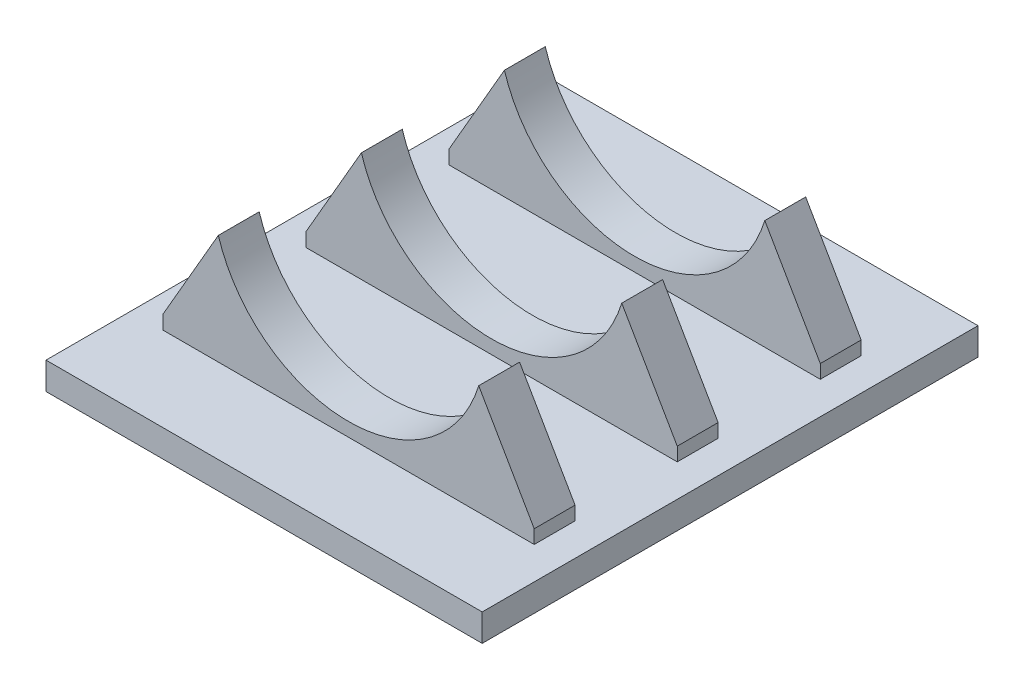
ISO-10303-21;
HEADER;
FILE_DESCRIPTION(('STEP AP214'),'2;1');
FILE_NAME('part.step','',(''),(''),'','','');
FILE_SCHEMA(('AUTOMOTIVE_DESIGN { 1 0 10303 214 1 1 1 1 }'));
ENDSEC;
DATA;
#1=APPLICATION_CONTEXT('core data for automotive mechanical design processes');
#2=APPLICATION_PROTOCOL_DEFINITION('international standard','automotive_design',2000,#1);
#3=PRODUCT_CONTEXT('',#1,'mechanical');
#4=PRODUCT('Part','Part','',(#3));
#5=PRODUCT_RELATED_PRODUCT_CATEGORY('part','',(#4));
#6=PRODUCT_DEFINITION_FORMATION('','',#4);
#7=PRODUCT_DEFINITION_CONTEXT('part definition',#1,'design');
#8=PRODUCT_DEFINITION('design','',#6,#7);
#9=PRODUCT_DEFINITION_SHAPE('','',#8);
#10=(LENGTH_UNIT() NAMED_UNIT(*) SI_UNIT(.MILLI.,.METRE.));
#11=(NAMED_UNIT(*) PLANE_ANGLE_UNIT() SI_UNIT($,.RADIAN.));
#12=(NAMED_UNIT(*) SI_UNIT($,.STERADIAN.) SOLID_ANGLE_UNIT());
#13=UNCERTAINTY_MEASURE_WITH_UNIT(LENGTH_MEASURE(1.E-05),#10,'distance_accuracy_value','');
#14=(GEOMETRIC_REPRESENTATION_CONTEXT(3) GLOBAL_UNCERTAINTY_ASSIGNED_CONTEXT((#13)) GLOBAL_UNIT_ASSIGNED_CONTEXT((#10,
#11,#12)) REPRESENTATION_CONTEXT('',''));
#15=CARTESIAN_POINT('',(0.,0.,0.));
#16=DIRECTION('',(0.,0.,1.));
#17=DIRECTION('',(1.,0.,0.));
#18=AXIS2_PLACEMENT_3D('',#15,#16,#17);
#19=CARTESIAN_POINT('',(0.,-4.99999999999908,0.));
#20=DIRECTION('',(0.,1.,0.));
#21=DIRECTION('',(0.,0.,1.));
#22=AXIS2_PLACEMENT_3D('',#19,#20,#21);
#23=PLANE('',#22);
#24=DIRECTION('',(0.,0.,-1.));
#25=VECTOR('',#24,1.);
#26=CARTESIAN_POINT('',(-68.1528501835808,-4.99999999999908,15.));
#27=LINE('',#26,#25);
#28=CARTESIAN_POINT('',(-68.1528501835808,-4.99999999999908,15.));
#29=VERTEX_POINT('',#28);
#30=CARTESIAN_POINT('',(-68.1528501835808,-4.99999999999908,0.));
#31=VERTEX_POINT('',#30);
#32=EDGE_CURVE('E340',#29,#31,#27,.T.);
#33=ORIENTED_EDGE('',*,*,#32,.T.);
#34=DIRECTION('',(1.,0.,0.));
#35=VECTOR('',#34,1.);
#36=CARTESIAN_POINT('',(-68.1528501835808,-4.99999999999908,0.));
#37=LINE('',#36,#35);
#38=CARTESIAN_POINT('',(68.152850183576,-4.99999999999908,0.));
#39=VERTEX_POINT('',#38);
#40=EDGE_CURVE('E326',#31,#39,#37,.T.);
#41=ORIENTED_EDGE('',*,*,#40,.T.);
#42=DIRECTION('',(0.,0.,-1.));
#43=VECTOR('',#42,1.);
#44=CARTESIAN_POINT('',(68.152850183576,-4.99999999999908,15.));
#45=LINE('',#44,#43);
#46=CARTESIAN_POINT('',(68.152850183576,-4.99999999999908,15.));
#47=VERTEX_POINT('',#46);
#48=EDGE_CURVE('E342',#47,#39,#45,.T.);
#49=ORIENTED_EDGE('',*,*,#48,.F.);
#50=DIRECTION('',(1.,0.,0.));
#51=VECTOR('',#50,1.);
#52=CARTESIAN_POINT('',(-68.1528501835808,-4.99999999999908,15.));
#53=LINE('',#52,#51);
#54=EDGE_CURVE('E313',#29,#47,#53,.T.);
#55=ORIENTED_EDGE('',*,*,#54,.F.);
#56=EDGE_LOOP('',(#33,#41,#49,#55));
#57=FACE_BOUND('',#56,.T.);
#58=DIRECTION('',(0.,0.,-1.));
#59=VECTOR('',#58,1.);
#60=CARTESIAN_POINT('',(80.0458637595088,-4.99999999999908,150.989001655881));
#61=LINE('',#60,#59);
#62=CARTESIAN_POINT('',(80.0458637595088,-4.99999999999908,150.989001655881));
#63=VERTEX_POINT('',#62);
#64=CARTESIAN_POINT('',(80.0458637595088,-4.99999999999908,-30.9890016558809));
#65=VERTEX_POINT('',#64);
#66=EDGE_CURVE('E264',#63,#65,#61,.T.);
#67=ORIENTED_EDGE('',*,*,#66,.T.);
#68=DIRECTION('',(-1.,0.,0.));
#69=VECTOR('',#68,1.);
#70=CARTESIAN_POINT('',(80.0458637595088,-4.99999999999908,-30.9890016558809));
#71=LINE('',#70,#69);
#72=CARTESIAN_POINT('',(-80.0458637595088,-4.99999999999908,-30.9890016558809));
#73=VERTEX_POINT('',#72);
#74=EDGE_CURVE('E291',#65,#73,#71,.T.);
#75=ORIENTED_EDGE('',*,*,#74,.T.);
#76=DIRECTION('',(0.,0.,-1.));
#77=VECTOR('',#76,1.);
#78=CARTESIAN_POINT('',(-80.0458637595088,-4.99999999999908,150.989001655881));
#79=LINE('',#78,#77);
#80=CARTESIAN_POINT('',(-80.0458637595088,-4.99999999999908,150.989001655881));
#81=VERTEX_POINT('',#80);
#82=EDGE_CURVE('E294',#81,#73,#79,.T.);
#83=ORIENTED_EDGE('',*,*,#82,.F.);
#84=DIRECTION('',(-1.,0.,0.));
#85=VECTOR('',#84,1.);
#86=CARTESIAN_POINT('',(80.0458637595088,-4.99999999999908,150.989001655881));
#87=LINE('',#86,#85);
#88=EDGE_CURVE('E281',#63,#81,#87,.T.);
#89=ORIENTED_EDGE('',*,*,#88,.F.);
#90=EDGE_LOOP('',(#67,#75,#83,#89));
#91=FACE_BOUND('',#90,.T.);
#92=DIRECTION('',(0.,0.,-1.));
#93=VECTOR('',#92,1.);
#94=CARTESIAN_POINT('',(68.152850183576,-4.99999999999908,67.5));
#95=LINE('',#94,#93);
#96=CARTESIAN_POINT('',(68.152850183576,-4.99999999999908,67.5));
#97=VERTEX_POINT('',#96);
#98=CARTESIAN_POINT('',(68.152850183576,-4.99999999999908,52.5));
#99=VERTEX_POINT('',#98);
#100=EDGE_CURVE('E273',#97,#99,#95,.T.);
#101=ORIENTED_EDGE('',*,*,#100,.F.);
#102=DIRECTION('',(1.,0.,0.));
#103=VECTOR('',#102,1.);
#104=CARTESIAN_POINT('',(-68.1528501835808,-4.99999999999908,67.5));
#105=LINE('',#104,#103);
#106=CARTESIAN_POINT('',(-68.1528501835808,-4.99999999999908,67.5));
#107=VERTEX_POINT('',#106);
#108=EDGE_CURVE('E238',#107,#97,#105,.T.);
#109=ORIENTED_EDGE('',*,*,#108,.F.);
#110=DIRECTION('',(0.,0.,-1.));
#111=VECTOR('',#110,1.);
#112=CARTESIAN_POINT('',(-68.1528501835808,-4.99999999999908,67.5));
#113=LINE('',#112,#111);
#114=CARTESIAN_POINT('',(-68.1528501835808,-4.99999999999908,52.5));
#115=VERTEX_POINT('',#114);
#116=EDGE_CURVE('E271',#107,#115,#113,.T.);
#117=ORIENTED_EDGE('',*,*,#116,.T.);
#118=DIRECTION('',(1.,0.,0.));
#119=VECTOR('',#118,1.);
#120=CARTESIAN_POINT('',(-68.1528501835808,-4.99999999999908,52.5));
#121=LINE('',#120,#119);
#122=EDGE_CURVE('E254',#115,#99,#121,.T.);
#123=ORIENTED_EDGE('',*,*,#122,.T.);
#124=EDGE_LOOP('',(#101,#109,#117,#123));
#125=FACE_BOUND('',#124,.T.);
#126=DIRECTION('',(0.,0.,-1.));
#127=VECTOR('',#126,1.);
#128=CARTESIAN_POINT('',(68.152850183576,-4.99999999999908,120.));
#129=LINE('',#128,#127);
#130=CARTESIAN_POINT('',(68.152850183576,-4.99999999999908,120.));
#131=VERTEX_POINT('',#130);
#132=CARTESIAN_POINT('',(68.152850183576,-4.99999999999908,105.));
#133=VERTEX_POINT('',#132);
#134=EDGE_CURVE('E55',#131,#133,#129,.T.);
#135=ORIENTED_EDGE('',*,*,#134,.F.);
#136=DIRECTION('',(1.,0.,0.));
#137=VECTOR('',#136,1.);
#138=CARTESIAN_POINT('',(-68.1528501835808,-4.99999999999908,120.));
#139=LINE('',#138,#137);
#140=CARTESIAN_POINT('',(-68.1528501835808,-4.99999999999908,120.));
#141=VERTEX_POINT('',#140);
#142=EDGE_CURVE('E50',#141,#131,#139,.T.);
#143=ORIENTED_EDGE('',*,*,#142,.F.);
#144=DIRECTION('',(0.,0.,-1.));
#145=VECTOR('',#144,1.);
#146=CARTESIAN_POINT('',(-68.1528501835808,-4.99999999999908,120.));
#147=LINE('',#146,#145);
#148=CARTESIAN_POINT('',(-68.1528501835808,-4.99999999999908,105.));
#149=VERTEX_POINT('',#148);
#150=EDGE_CURVE('E229',#141,#149,#147,.T.);
#151=ORIENTED_EDGE('',*,*,#150,.T.);
#152=DIRECTION('',(1.,0.,0.));
#153=VECTOR('',#152,1.);
#154=CARTESIAN_POINT('',(-68.1528501835808,-4.99999999999908,105.));
#155=LINE('',#154,#153);
#156=EDGE_CURVE('E215',#149,#133,#155,.T.);
#157=ORIENTED_EDGE('',*,*,#156,.T.);
#158=EDGE_LOOP('',(#135,#143,#151,#157));
#159=FACE_BOUND('',#158,.T.);
#160=ADVANCED_FACE('F33',(#57,#91,#125,#159),#23,.T.);
#161=CARTESIAN_POINT('',(47.7840512524467,35.2797946378719,15.));
#162=DIRECTION('',(0.86602540378444,0.499999999999998,0.));
#163=DIRECTION('',(-0.499999999999998,0.86602540378444,0.));
#164=AXIS2_PLACEMENT_3D('',#161,#162,#163);
#165=PLANE('',#164);
#166=DIRECTION('',(0.499999999999998,-0.86602540378444,0.));
#167=VECTOR('',#166,1.);
#168=CARTESIAN_POINT('',(47.7840512524467,35.2797946378719,0.));
#169=LINE('',#168,#167);
#170=CARTESIAN_POINT('',(47.7840512524472,35.2797946378717,0.));
#171=VERTEX_POINT('',#170);
#172=CARTESIAN_POINT('',(68.152850183576,9.24607612695653E-13,0.));
#173=VERTEX_POINT('',#172);
#174=EDGE_CURVE('E300',#171,#173,#169,.T.);
#175=ORIENTED_EDGE('',*,*,#174,.F.);
#176=DIRECTION('',(0.,0.,-1.));
#177=VECTOR('',#176,1.);
#178=CARTESIAN_POINT('',(47.7840512524472,35.2797946378717,15.));
#179=LINE('',#178,#177);
#180=CARTESIAN_POINT('',(47.7840512524472,35.2797946378717,15.));
#181=VERTEX_POINT('',#180);
#182=EDGE_CURVE('E11',#181,#171,#179,.T.);
#183=ORIENTED_EDGE('',*,*,#182,.F.);
#184=DIRECTION('',(0.499999999999998,-0.86602540378444,0.));
#185=VECTOR('',#184,1.);
#186=CARTESIAN_POINT('',(47.7840512524467,35.2797946378719,15.));
#187=LINE('',#186,#185);
#188=CARTESIAN_POINT('',(68.152850183576,9.24607612695653E-13,15.));
#189=VERTEX_POINT('',#188);
#190=EDGE_CURVE('E307',#181,#189,#187,.T.);
#191=ORIENTED_EDGE('',*,*,#190,.T.);
#192=DIRECTION('',(0.,0.,-1.));
#193=VECTOR('',#192,1.);
#194=CARTESIAN_POINT('',(68.152850183576,9.24607612695653E-13,15.));
#195=LINE('',#194,#193);
#196=EDGE_CURVE('E37',#189,#173,#195,.T.);
#197=ORIENTED_EDGE('',*,*,#196,.T.);
#198=EDGE_LOOP('',(#175,#183,#191,#197));
#199=FACE_BOUND('',#198,.T.);
#200=ADVANCED_FACE('F35',(#199),#165,.T.);
#201=CARTESIAN_POINT('',(-1.83980326487098E-12,50.0000000000026,15.));
#202=DIRECTION('',(0.,0.,-1.));
#203=DIRECTION('',(-1.,0.,0.));
#204=AXIS2_PLACEMENT_3D('',#201,#202,#203);
#205=CYLINDRICAL_SURFACE('',#204,49.9999999999998);
#206=CARTESIAN_POINT('',(-1.83980326487098E-12,50.0000000000026,0.));
#207=DIRECTION('',(0.,0.,-1.));
#208=DIRECTION('',(-1.,0.,0.));
#209=AXIS2_PLACEMENT_3D('',#206,#207,#208);
#210=CIRCLE('',#209,49.9999999999998);
#211=CARTESIAN_POINT('',(-47.7840512524509,35.279794637872,0.));
#212=VERTEX_POINT('',#211);
#213=EDGE_CURVE('E311',#171,#212,#210,.T.);
#214=ORIENTED_EDGE('',*,*,#213,.T.);
#215=DIRECTION('',(0.,0.,-1.));
#216=VECTOR('',#215,1.);
#217=CARTESIAN_POINT('',(-47.7840512524509,35.279794637872,15.));
#218=LINE('',#217,#216);
#219=CARTESIAN_POINT('',(-47.7840512524509,35.279794637872,15.));
#220=VERTEX_POINT('',#219);
#221=EDGE_CURVE('E42',#220,#212,#218,.T.);
#222=ORIENTED_EDGE('',*,*,#221,.F.);
#223=CARTESIAN_POINT('',(-1.83980326487098E-12,50.0000000000026,15.));
#224=DIRECTION('',(0.,0.,-1.));
#225=DIRECTION('',(-1.,0.,0.));
#226=AXIS2_PLACEMENT_3D('',#223,#224,#225);
#227=CIRCLE('',#226,49.9999999999998);
#228=EDGE_CURVE('E319',#181,#220,#227,.T.);
#229=ORIENTED_EDGE('',*,*,#228,.F.);
#230=ORIENTED_EDGE('',*,*,#182,.T.);
#231=EDGE_LOOP('',(#214,#222,#229,#230));
#232=FACE_BOUND('',#231,.T.);
#233=ADVANCED_FACE('F359',(#232),#205,.F.);
#234=CARTESIAN_POINT('',(-47.7840512524514,35.2797946378719,15.));
#235=DIRECTION('',(0.86602540378444,-0.499999999999998,0.));
#236=DIRECTION('',(0.499999999999998,0.86602540378444,0.));
#237=AXIS2_PLACEMENT_3D('',#234,#235,#236);
#238=PLANE('',#237);
#239=DIRECTION('',(-0.499999999999998,-0.86602540378444,0.));
#240=VECTOR('',#239,1.);
#241=CARTESIAN_POINT('',(-47.7840512524514,35.2797946378719,0.));
#242=LINE('',#241,#240);
#243=CARTESIAN_POINT('',(-68.1528501835808,9.24607612695653E-13,0.));
#244=VERTEX_POINT('',#243);
#245=EDGE_CURVE('E332',#212,#244,#242,.T.);
#246=ORIENTED_EDGE('',*,*,#245,.T.);
#247=DIRECTION('',(0.,0.,-1.));
#248=VECTOR('',#247,1.);
#249=CARTESIAN_POINT('',(-68.1528501835808,9.24607612695653E-13,15.));
#250=LINE('',#249,#248);
#251=CARTESIAN_POINT('',(-68.1528501835808,9.24607612695653E-13,15.));
#252=VERTEX_POINT('',#251);
#253=EDGE_CURVE('E337',#252,#244,#250,.T.);
#254=ORIENTED_EDGE('',*,*,#253,.F.);
#255=DIRECTION('',(-0.499999999999998,-0.86602540378444,0.));
#256=VECTOR('',#255,1.);
#257=CARTESIAN_POINT('',(-47.7840512524514,35.2797946378719,15.));
#258=LINE('',#257,#256);
#259=EDGE_CURVE('E317',#220,#252,#258,.T.);
#260=ORIENTED_EDGE('',*,*,#259,.F.);
#261=ORIENTED_EDGE('',*,*,#221,.T.);
#262=EDGE_LOOP('',(#246,#254,#260,#261));
#263=FACE_BOUND('',#262,.T.);
#264=ADVANCED_FACE('F363',(#263),#238,.F.);
#265=CARTESIAN_POINT('',(-68.1528501835808,9.24607612695653E-13,15.));
#266=DIRECTION('',(1.,0.,0.));
#267=DIRECTION('',(0.,1.,0.));
#268=AXIS2_PLACEMENT_3D('',#265,#266,#267);
#269=PLANE('',#268);
#270=DIRECTION('',(0.,-1.,0.));
#271=VECTOR('',#270,1.);
#272=CARTESIAN_POINT('',(-68.1528501835808,9.24607612695653E-13,0.));
#273=LINE('',#272,#271);
#274=EDGE_CURVE('E329',#244,#31,#273,.T.);
#275=ORIENTED_EDGE('',*,*,#274,.T.);
#276=ORIENTED_EDGE('',*,*,#32,.F.);
#277=DIRECTION('',(0.,-1.,0.));
#278=VECTOR('',#277,1.);
#279=CARTESIAN_POINT('',(-68.1528501835808,9.24607612695653E-13,15.));
#280=LINE('',#279,#278);
#281=EDGE_CURVE('E315',#252,#29,#280,.T.);
#282=ORIENTED_EDGE('',*,*,#281,.F.);
#283=ORIENTED_EDGE('',*,*,#253,.T.);
#284=EDGE_LOOP('',(#275,#276,#282,#283));
#285=FACE_BOUND('',#284,.T.);
#286=ADVANCED_FACE('F373',(#285),#269,.F.);
#287=CARTESIAN_POINT('',(68.152850183576,-4.99999999999908,15.));
#288=DIRECTION('',(-1.,0.,0.));
#289=DIRECTION('',(0.,-1.,0.));
#290=AXIS2_PLACEMENT_3D('',#287,#288,#289);
#291=PLANE('',#290);
#292=DIRECTION('',(0.,1.,0.));
#293=VECTOR('',#292,1.);
#294=CARTESIAN_POINT('',(68.152850183576,-4.99999999999908,0.));
#295=LINE('',#294,#293);
#296=EDGE_CURVE('E323',#39,#173,#295,.T.);
#297=ORIENTED_EDGE('',*,*,#296,.T.);
#298=ORIENTED_EDGE('',*,*,#196,.F.);
#299=DIRECTION('',(0.,1.,0.));
#300=VECTOR('',#299,1.);
#301=CARTESIAN_POINT('',(68.152850183576,-4.99999999999908,15.));
#302=LINE('',#301,#300);
#303=EDGE_CURVE('E310',#47,#189,#302,.T.);
#304=ORIENTED_EDGE('',*,*,#303,.F.);
#305=ORIENTED_EDGE('',*,*,#48,.T.);
#306=EDGE_LOOP('',(#297,#298,#304,#305));
#307=FACE_BOUND('',#306,.T.);
#308=ADVANCED_FACE('F351',(#307),#291,.F.);
#309=CARTESIAN_POINT('',(-1.83980326487098E-12,50.0000000000026,15.));
#310=DIRECTION('',(0.,0.,-1.));
#311=DIRECTION('',(-1.,0.,0.));
#312=AXIS2_PLACEMENT_3D('',#309,#310,#311);
#313=PLANE('',#312);
#314=ORIENTED_EDGE('',*,*,#190,.F.);
#315=ORIENTED_EDGE('',*,*,#228,.T.);
#316=ORIENTED_EDGE('',*,*,#259,.T.);
#317=ORIENTED_EDGE('',*,*,#281,.T.);
#318=ORIENTED_EDGE('',*,*,#54,.T.);
#319=ORIENTED_EDGE('',*,*,#303,.T.);
#320=EDGE_LOOP('',(#314,#315,#316,#317,#318,#319));
#321=FACE_BOUND('',#320,.T.);
#322=ADVANCED_FACE('F367',(#321),#313,.F.);
#323=CARTESIAN_POINT('',(-1.83980326487098E-12,50.0000000000026,0.));
#324=DIRECTION('',(0.,0.,-1.));
#325=DIRECTION('',(-1.,0.,0.));
#326=AXIS2_PLACEMENT_3D('',#323,#324,#325);
#327=PLANE('',#326);
#328=ORIENTED_EDGE('',*,*,#174,.T.);
#329=ORIENTED_EDGE('',*,*,#296,.F.);
#330=ORIENTED_EDGE('',*,*,#40,.F.);
#331=ORIENTED_EDGE('',*,*,#274,.F.);
#332=ORIENTED_EDGE('',*,*,#245,.F.);
#333=ORIENTED_EDGE('',*,*,#213,.F.);
#334=EDGE_LOOP('',(#328,#329,#330,#331,#332,#333));
#335=FACE_BOUND('',#334,.T.);
#336=ADVANCED_FACE('F354',(#335),#327,.T.);
#337=CARTESIAN_POINT('',(80.0458637595088,-14.9999999999991,150.989001655881));
#338=DIRECTION('',(1.,0.,0.));
#339=DIRECTION('',(0.,0.,-1.));
#340=AXIS2_PLACEMENT_3D('',#337,#338,#339);
#341=PLANE('',#340);
#342=ORIENTED_EDGE('',*,*,#66,.F.);
#343=DIRECTION('',(0.,1.,0.));
#344=VECTOR('',#343,1.);
#345=CARTESIAN_POINT('',(80.0458637595088,-14.9999999999991,150.989001655881));
#346=LINE('',#345,#344);
#347=CARTESIAN_POINT('',(80.0458637595088,-14.9999999999991,150.989001655881));
#348=VERTEX_POINT('',#347);
#349=EDGE_CURVE('E298',#348,#63,#346,.T.);
#350=ORIENTED_EDGE('',*,*,#349,.F.);
#351=DIRECTION('',(0.,0.,-1.));
#352=VECTOR('',#351,1.);
#353=CARTESIAN_POINT('',(80.0458637595088,-14.9999999999991,150.989001655881));
#354=LINE('',#353,#352);
#355=CARTESIAN_POINT('',(80.0458637595088,-14.9999999999991,-30.9890016558809));
#356=VERTEX_POINT('',#355);
#357=EDGE_CURVE('E277',#348,#356,#354,.T.);
#358=ORIENTED_EDGE('',*,*,#357,.T.);
#359=DIRECTION('',(0.,1.,0.));
#360=VECTOR('',#359,1.);
#361=CARTESIAN_POINT('',(80.0458637595088,-14.9999999999991,-30.9890016558809));
#362=LINE('',#361,#360);
#363=EDGE_CURVE('E288',#356,#65,#362,.T.);
#364=ORIENTED_EDGE('',*,*,#363,.T.);
#365=EDGE_LOOP('',(#342,#350,#358,#364));
#366=FACE_BOUND('',#365,.T.);
#367=ADVANCED_FACE('F394',(#366),#341,.T.);
#368=CARTESIAN_POINT('',(80.0458637595088,-14.9999999999991,150.989001655881));
#369=DIRECTION('',(0.,0.,-1.));
#370=DIRECTION('',(-1.,0.,0.));
#371=AXIS2_PLACEMENT_3D('',#368,#369,#370);
#372=PLANE('',#371);
#373=ORIENTED_EDGE('',*,*,#88,.T.);
#374=DIRECTION('',(0.,1.,0.));
#375=VECTOR('',#374,1.);
#376=CARTESIAN_POINT('',(-80.0458637595088,-14.9999999999991,150.989001655881));
#377=LINE('',#376,#375);
#378=CARTESIAN_POINT('',(-80.0458637595088,-14.9999999999991,150.989001655881));
#379=VERTEX_POINT('',#378);
#380=EDGE_CURVE('E301',#379,#81,#377,.T.);
#381=ORIENTED_EDGE('',*,*,#380,.F.);
#382=DIRECTION('',(-1.,0.,0.));
#383=VECTOR('',#382,1.);
#384=CARTESIAN_POINT('',(80.0458637595088,-14.9999999999991,150.989001655881));
#385=LINE('',#384,#383);
#386=EDGE_CURVE('E286',#348,#379,#385,.T.);
#387=ORIENTED_EDGE('',*,*,#386,.F.);
#388=ORIENTED_EDGE('',*,*,#349,.T.);
#389=EDGE_LOOP('',(#373,#381,#387,#388));
#390=FACE_BOUND('',#389,.T.);
#391=ADVANCED_FACE('F390',(#390),#372,.F.);
#392=CARTESIAN_POINT('',(-80.0458637595088,-14.9999999999991,150.989001655881));
#393=DIRECTION('',(1.,0.,0.));
#394=DIRECTION('',(0.,0.,-1.));
#395=AXIS2_PLACEMENT_3D('',#392,#393,#394);
#396=PLANE('',#395);
#397=ORIENTED_EDGE('',*,*,#82,.T.);
#398=DIRECTION('',(0.,1.,0.));
#399=VECTOR('',#398,1.);
#400=CARTESIAN_POINT('',(-80.0458637595088,-14.9999999999991,-30.9890016558809));
#401=LINE('',#400,#399);
#402=CARTESIAN_POINT('',(-80.0458637595088,-14.9999999999991,-30.9890016558809));
#403=VERTEX_POINT('',#402);
#404=EDGE_CURVE('E304',#403,#73,#401,.T.);
#405=ORIENTED_EDGE('',*,*,#404,.F.);
#406=DIRECTION('',(0.,0.,-1.));
#407=VECTOR('',#406,1.);
#408=CARTESIAN_POINT('',(-80.0458637595088,-14.9999999999991,150.989001655881));
#409=LINE('',#408,#407);
#410=EDGE_CURVE('E284',#379,#403,#409,.T.);
#411=ORIENTED_EDGE('',*,*,#410,.F.);
#412=ORIENTED_EDGE('',*,*,#380,.T.);
#413=EDGE_LOOP('',(#397,#405,#411,#412));
#414=FACE_BOUND('',#413,.T.);
#415=ADVANCED_FACE('F393',(#414),#396,.F.);
#416=CARTESIAN_POINT('',(80.0458637595088,-14.9999999999991,-30.9890016558809));
#417=DIRECTION('',(0.,0.,-1.));
#418=DIRECTION('',(-1.,0.,0.));
#419=AXIS2_PLACEMENT_3D('',#416,#417,#418);
#420=PLANE('',#419);
#421=ORIENTED_EDGE('',*,*,#74,.F.);
#422=ORIENTED_EDGE('',*,*,#363,.F.);
#423=DIRECTION('',(-1.,0.,0.));
#424=VECTOR('',#423,1.);
#425=CARTESIAN_POINT('',(80.0458637595088,-14.9999999999991,-30.9890016558809));
#426=LINE('',#425,#424);
#427=EDGE_CURVE('E280',#356,#403,#426,.T.);
#428=ORIENTED_EDGE('',*,*,#427,.T.);
#429=ORIENTED_EDGE('',*,*,#404,.T.);
#430=EDGE_LOOP('',(#421,#422,#428,#429));
#431=FACE_BOUND('',#430,.T.);
#432=ADVANCED_FACE('F398',(#431),#420,.T.);
#433=CARTESIAN_POINT('',(0.,-14.9999999999991,0.));
#434=DIRECTION('',(0.,1.,0.));
#435=DIRECTION('',(0.,0.,1.));
#436=AXIS2_PLACEMENT_3D('',#433,#434,#435);
#437=PLANE('',#436);
#438=ORIENTED_EDGE('',*,*,#357,.F.);
#439=ORIENTED_EDGE('',*,*,#386,.T.);
#440=ORIENTED_EDGE('',*,*,#410,.T.);
#441=ORIENTED_EDGE('',*,*,#427,.F.);
#442=EDGE_LOOP('',(#438,#439,#440,#441));
#443=FACE_BOUND('',#442,.T.);
#444=ADVANCED_FACE('F388',(#443),#437,.F.);
#445=CARTESIAN_POINT('',(47.7840512524467,35.2797946378719,67.5));
#446=DIRECTION('',(0.86602540378444,0.499999999999998,0.));
#447=DIRECTION('',(-0.499999999999998,0.86602540378444,0.));
#448=AXIS2_PLACEMENT_3D('',#445,#446,#447);
#449=PLANE('',#448);
#450=DIRECTION('',(0.499999999999998,-0.86602540378444,0.));
#451=VECTOR('',#450,1.);
#452=CARTESIAN_POINT('',(47.7840512524467,35.2797946378719,52.5));
#453=LINE('',#452,#451);
#454=CARTESIAN_POINT('',(47.7840512524472,35.2797946378717,52.5));
#455=VERTEX_POINT('',#454);
#456=CARTESIAN_POINT('',(68.152850183576,9.24607612695653E-13,52.5));
#457=VERTEX_POINT('',#456);
#458=EDGE_CURVE('E222',#455,#457,#453,.T.);
#459=ORIENTED_EDGE('',*,*,#458,.F.);
#460=DIRECTION('',(0.,0.,-1.));
#461=VECTOR('',#460,1.);
#462=CARTESIAN_POINT('',(47.7840512524472,35.2797946378717,67.5));
#463=LINE('',#462,#461);
#464=CARTESIAN_POINT('',(47.7840512524472,35.2797946378717,67.5));
#465=VERTEX_POINT('',#464);
#466=EDGE_CURVE('E262',#465,#455,#463,.T.);
#467=ORIENTED_EDGE('',*,*,#466,.F.);
#468=DIRECTION('',(0.499999999999998,-0.86602540378444,0.));
#469=VECTOR('',#468,1.);
#470=CARTESIAN_POINT('',(47.7840512524467,35.2797946378719,67.5));
#471=LINE('',#470,#469);
#472=CARTESIAN_POINT('',(68.152850183576,9.24607612695653E-13,67.5));
#473=VERTEX_POINT('',#472);
#474=EDGE_CURVE('E232',#465,#473,#471,.T.);
#475=ORIENTED_EDGE('',*,*,#474,.T.);
#476=DIRECTION('',(0.,0.,-1.));
#477=VECTOR('',#476,1.);
#478=CARTESIAN_POINT('',(68.152850183576,9.24607612695653E-13,67.5));
#479=LINE('',#478,#477);
#480=EDGE_CURVE('E248',#473,#457,#479,.T.);
#481=ORIENTED_EDGE('',*,*,#480,.T.);
#482=EDGE_LOOP('',(#459,#467,#475,#481));
#483=FACE_BOUND('',#482,.T.);
#484=ADVANCED_FACE('F480',(#483),#449,.T.);
#485=CARTESIAN_POINT('',(-1.83980326487098E-12,50.0000000000026,67.5));
#486=DIRECTION('',(0.,0.,-1.));
#487=DIRECTION('',(-1.,0.,0.));
#488=AXIS2_PLACEMENT_3D('',#485,#486,#487);
#489=CYLINDRICAL_SURFACE('',#488,49.9999999999998);
#490=CARTESIAN_POINT('',(-1.83980326487098E-12,50.0000000000026,52.5));
#491=DIRECTION('',(0.,0.,-1.));
#492=DIRECTION('',(-1.,0.,0.));
#493=AXIS2_PLACEMENT_3D('',#490,#491,#492);
#494=CIRCLE('',#493,49.9999999999998);
#495=CARTESIAN_POINT('',(-47.7840512524509,35.279794637872,52.5));
#496=VERTEX_POINT('',#495);
#497=EDGE_CURVE('E236',#455,#496,#494,.T.);
#498=ORIENTED_EDGE('',*,*,#497,.T.);
#499=DIRECTION('',(0.,0.,-1.));
#500=VECTOR('',#499,1.);
#501=CARTESIAN_POINT('',(-47.7840512524509,35.279794637872,67.5));
#502=LINE('',#501,#500);
#503=CARTESIAN_POINT('',(-47.7840512524509,35.279794637872,67.5));
#504=VERTEX_POINT('',#503);
#505=EDGE_CURVE('E265',#504,#496,#502,.T.);
#506=ORIENTED_EDGE('',*,*,#505,.F.);
#507=CARTESIAN_POINT('',(-1.83980326487098E-12,50.0000000000026,67.5));
#508=DIRECTION('',(0.,0.,-1.));
#509=DIRECTION('',(-1.,0.,0.));
#510=AXIS2_PLACEMENT_3D('',#507,#508,#509);
#511=CIRCLE('',#510,49.9999999999998);
#512=EDGE_CURVE('E246',#465,#504,#511,.T.);
#513=ORIENTED_EDGE('',*,*,#512,.F.);
#514=ORIENTED_EDGE('',*,*,#466,.T.);
#515=EDGE_LOOP('',(#498,#506,#513,#514));
#516=FACE_BOUND('',#515,.T.);
#517=ADVANCED_FACE('F488',(#516),#489,.F.);
#518=CARTESIAN_POINT('',(-47.7840512524514,35.2797946378719,67.5));
#519=DIRECTION('',(0.86602540378444,-0.499999999999998,0.));
#520=DIRECTION('',(0.499999999999998,0.86602540378444,0.));
#521=AXIS2_PLACEMENT_3D('',#518,#519,#520);
#522=PLANE('',#521);
#523=DIRECTION('',(-0.499999999999998,-0.86602540378444,0.));
#524=VECTOR('',#523,1.);
#525=CARTESIAN_POINT('',(-47.7840512524514,35.2797946378719,52.5));
#526=LINE('',#525,#524);
#527=CARTESIAN_POINT('',(-68.1528501835808,9.24607612695653E-13,52.5));
#528=VERTEX_POINT('',#527);
#529=EDGE_CURVE('E259',#496,#528,#526,.T.);
#530=ORIENTED_EDGE('',*,*,#529,.T.);
#531=DIRECTION('',(0.,0.,-1.));
#532=VECTOR('',#531,1.);
#533=CARTESIAN_POINT('',(-68.1528501835808,9.24607612695653E-13,67.5));
#534=LINE('',#533,#532);
#535=CARTESIAN_POINT('',(-68.1528501835808,9.24607612695653E-13,67.5));
#536=VERTEX_POINT('',#535);
#537=EDGE_CURVE('E268',#536,#528,#534,.T.);
#538=ORIENTED_EDGE('',*,*,#537,.F.);
#539=DIRECTION('',(-0.499999999999998,-0.86602540378444,0.));
#540=VECTOR('',#539,1.);
#541=CARTESIAN_POINT('',(-47.7840512524514,35.2797946378719,67.5));
#542=LINE('',#541,#540);
#543=EDGE_CURVE('E244',#504,#536,#542,.T.);
#544=ORIENTED_EDGE('',*,*,#543,.F.);
#545=ORIENTED_EDGE('',*,*,#505,.T.);
#546=EDGE_LOOP('',(#530,#538,#544,#545));
#547=FACE_BOUND('',#546,.T.);
#548=ADVANCED_FACE('F497',(#547),#522,.F.);
#549=CARTESIAN_POINT('',(-68.1528501835808,9.24607612695653E-13,67.5));
#550=DIRECTION('',(1.,0.,0.));
#551=DIRECTION('',(0.,1.,0.));
#552=AXIS2_PLACEMENT_3D('',#549,#550,#551);
#553=PLANE('',#552);
#554=DIRECTION('',(0.,-1.,0.));
#555=VECTOR('',#554,1.);
#556=CARTESIAN_POINT('',(-68.1528501835808,9.24607612695653E-13,52.5));
#557=LINE('',#556,#555);
#558=EDGE_CURVE('E256',#528,#115,#557,.T.);
#559=ORIENTED_EDGE('',*,*,#558,.T.);
#560=ORIENTED_EDGE('',*,*,#116,.F.);
#561=DIRECTION('',(0.,-1.,0.));
#562=VECTOR('',#561,1.);
#563=CARTESIAN_POINT('',(-68.1528501835808,9.24607612695653E-13,67.5));
#564=LINE('',#563,#562);
#565=EDGE_CURVE('E241',#536,#107,#564,.T.);
#566=ORIENTED_EDGE('',*,*,#565,.F.);
#567=ORIENTED_EDGE('',*,*,#537,.T.);
#568=EDGE_LOOP('',(#559,#560,#566,#567));
#569=FACE_BOUND('',#568,.T.);
#570=ADVANCED_FACE('F507',(#569),#553,.F.);
#571=CARTESIAN_POINT('',(68.152850183576,-4.99999999999908,67.5));
#572=DIRECTION('',(-1.,0.,0.));
#573=DIRECTION('',(0.,-1.,0.));
#574=AXIS2_PLACEMENT_3D('',#571,#572,#573);
#575=PLANE('',#574);
#576=DIRECTION('',(0.,1.,0.));
#577=VECTOR('',#576,1.);
#578=CARTESIAN_POINT('',(68.152850183576,-4.99999999999908,52.5));
#579=LINE('',#578,#577);
#580=EDGE_CURVE('E251',#99,#457,#579,.T.);
#581=ORIENTED_EDGE('',*,*,#580,.T.);
#582=ORIENTED_EDGE('',*,*,#480,.F.);
#583=DIRECTION('',(0.,1.,0.));
#584=VECTOR('',#583,1.);
#585=CARTESIAN_POINT('',(68.152850183576,-4.99999999999908,67.5));
#586=LINE('',#585,#584);
#587=EDGE_CURVE('E235',#97,#473,#586,.T.);
#588=ORIENTED_EDGE('',*,*,#587,.F.);
#589=ORIENTED_EDGE('',*,*,#100,.T.);
#590=EDGE_LOOP('',(#581,#582,#588,#589));
#591=FACE_BOUND('',#590,.T.);
#592=ADVANCED_FACE('F517',(#591),#575,.F.);
#593=CARTESIAN_POINT('',(-1.83980326487098E-12,50.0000000000026,67.5));
#594=DIRECTION('',(0.,0.,-1.));
#595=DIRECTION('',(-1.,0.,0.));
#596=AXIS2_PLACEMENT_3D('',#593,#594,#595);
#597=PLANE('',#596);
#598=ORIENTED_EDGE('',*,*,#474,.F.);
#599=ORIENTED_EDGE('',*,*,#512,.T.);
#600=ORIENTED_EDGE('',*,*,#543,.T.);
#601=ORIENTED_EDGE('',*,*,#565,.T.);
#602=ORIENTED_EDGE('',*,*,#108,.T.);
#603=ORIENTED_EDGE('',*,*,#587,.T.);
#604=EDGE_LOOP('',(#598,#599,#600,#601,#602,#603));
#605=FACE_BOUND('',#604,.T.);
#606=ADVANCED_FACE('F527',(#605),#597,.F.);
#607=CARTESIAN_POINT('',(-1.83980326487098E-12,50.0000000000026,52.5));
#608=DIRECTION('',(0.,0.,-1.));
#609=DIRECTION('',(-1.,0.,0.));
#610=AXIS2_PLACEMENT_3D('',#607,#608,#609);
#611=PLANE('',#610);
#612=ORIENTED_EDGE('',*,*,#458,.T.);
#613=ORIENTED_EDGE('',*,*,#580,.F.);
#614=ORIENTED_EDGE('',*,*,#122,.F.);
#615=ORIENTED_EDGE('',*,*,#558,.F.);
#616=ORIENTED_EDGE('',*,*,#529,.F.);
#617=ORIENTED_EDGE('',*,*,#497,.F.);
#618=EDGE_LOOP('',(#612,#613,#614,#615,#616,#617));
#619=FACE_BOUND('',#618,.T.);
#620=ADVANCED_FACE('F537',(#619),#611,.T.);
#621=CARTESIAN_POINT('',(47.7840512524467,35.2797946378719,120.));
#622=DIRECTION('',(0.86602540378444,0.499999999999998,0.));
#623=DIRECTION('',(-0.499999999999998,0.86602540378444,0.));
#624=AXIS2_PLACEMENT_3D('',#621,#622,#623);
#625=PLANE('',#624);
#626=DIRECTION('',(0.499999999999998,-0.86602540378444,0.));
#627=VECTOR('',#626,1.);
#628=CARTESIAN_POINT('',(47.7840512524467,35.2797946378719,105.));
#629=LINE('',#628,#627);
#630=CARTESIAN_POINT('',(47.7840512524472,35.2797946378717,105.));
#631=VERTEX_POINT('',#630);
#632=CARTESIAN_POINT('',(68.152850183576,9.24607612695653E-13,105.));
#633=VERTEX_POINT('',#632);
#634=EDGE_CURVE('E212',#631,#633,#629,.T.);
#635=ORIENTED_EDGE('',*,*,#634,.F.);
#636=DIRECTION('',(0.,0.,-1.));
#637=VECTOR('',#636,1.);
#638=CARTESIAN_POINT('',(47.7840512524472,35.2797946378717,120.));
#639=LINE('',#638,#637);
#640=CARTESIAN_POINT('',(47.7840512524472,35.2797946378717,120.));
#641=VERTEX_POINT('',#640);
#642=EDGE_CURVE('E199',#641,#631,#639,.T.);
#643=ORIENTED_EDGE('',*,*,#642,.F.);
#644=DIRECTION('',(0.499999999999998,-0.86602540378444,0.));
#645=VECTOR('',#644,1.);
#646=CARTESIAN_POINT('',(47.7840512524467,35.2797946378719,120.));
#647=LINE('',#646,#645);
#648=CARTESIAN_POINT('',(68.152850183576,9.24607612695653E-13,120.));
#649=VERTEX_POINT('',#648);
#650=EDGE_CURVE('E185',#641,#649,#647,.T.);
#651=ORIENTED_EDGE('',*,*,#650,.T.);
#652=DIRECTION('',(0.,0.,-1.));
#653=VECTOR('',#652,1.);
#654=CARTESIAN_POINT('',(68.152850183576,9.24607612695653E-13,120.));
#655=LINE('',#654,#653);
#656=EDGE_CURVE('E189',#649,#633,#655,.T.);
#657=ORIENTED_EDGE('',*,*,#656,.T.);
#658=EDGE_LOOP('',(#635,#643,#651,#657));
#659=FACE_BOUND('',#658,.T.);
#660=ADVANCED_FACE('F198',(#659),#625,.T.);
#661=CARTESIAN_POINT('',(-1.83980326487098E-12,50.0000000000026,120.));
#662=DIRECTION('',(0.,0.,-1.));
#663=DIRECTION('',(-1.,0.,0.));
#664=AXIS2_PLACEMENT_3D('',#661,#662,#663);
#665=CYLINDRICAL_SURFACE('',#664,49.9999999999998);
#666=CARTESIAN_POINT('',(-1.83980326487098E-12,50.0000000000026,105.));
#667=DIRECTION('',(0.,0.,-1.));
#668=DIRECTION('',(-1.,0.,0.));
#669=AXIS2_PLACEMENT_3D('',#666,#667,#668);
#670=CIRCLE('',#669,49.9999999999998);
#671=CARTESIAN_POINT('',(-47.7840512524509,35.279794637872,105.));
#672=VERTEX_POINT('',#671);
#673=EDGE_CURVE('E201',#631,#672,#670,.T.);
#674=ORIENTED_EDGE('',*,*,#673,.T.);
#675=DIRECTION('',(0.,0.,-1.));
#676=VECTOR('',#675,1.);
#677=CARTESIAN_POINT('',(-47.7840512524509,35.279794637872,120.));
#678=LINE('',#677,#676);
#679=CARTESIAN_POINT('',(-47.7840512524509,35.279794637872,120.));
#680=VERTEX_POINT('',#679);
#681=EDGE_CURVE('E223',#680,#672,#678,.T.);
#682=ORIENTED_EDGE('',*,*,#681,.F.);
#683=CARTESIAN_POINT('',(-1.83980326487098E-12,50.0000000000026,120.));
#684=DIRECTION('',(0.,0.,-1.));
#685=DIRECTION('',(-1.,0.,0.));
#686=AXIS2_PLACEMENT_3D('',#683,#684,#685);
#687=CIRCLE('',#686,49.9999999999998);
#688=EDGE_CURVE('E196',#641,#680,#687,.T.);
#689=ORIENTED_EDGE('',*,*,#688,.F.);
#690=ORIENTED_EDGE('',*,*,#642,.T.);
#691=EDGE_LOOP('',(#674,#682,#689,#690));
#692=FACE_BOUND('',#691,.T.);
#693=ADVANCED_FACE('F556',(#692),#665,.F.);
#694=CARTESIAN_POINT('',(-47.7840512524514,35.2797946378719,120.));
#695=DIRECTION('',(0.86602540378444,-0.499999999999998,0.));
#696=DIRECTION('',(0.499999999999998,0.86602540378444,0.));
#697=AXIS2_PLACEMENT_3D('',#694,#695,#696);
#698=PLANE('',#697);
#699=DIRECTION('',(-0.499999999999998,-0.86602540378444,0.));
#700=VECTOR('',#699,1.);
#701=CARTESIAN_POINT('',(-47.7840512524514,35.2797946378719,105.));
#702=LINE('',#701,#700);
#703=CARTESIAN_POINT('',(-68.1528501835808,9.24607612695653E-13,105.));
#704=VERTEX_POINT('',#703);
#705=EDGE_CURVE('E203',#672,#704,#702,.T.);
#706=ORIENTED_EDGE('',*,*,#705,.T.);
#707=DIRECTION('',(0.,0.,-1.));
#708=VECTOR('',#707,1.);
#709=CARTESIAN_POINT('',(-68.1528501835808,9.24607612695653E-13,120.));
#710=LINE('',#709,#708);
#711=CARTESIAN_POINT('',(-68.1528501835808,9.24607612695653E-13,120.));
#712=VERTEX_POINT('',#711);
#713=EDGE_CURVE('E226',#712,#704,#710,.T.);
#714=ORIENTED_EDGE('',*,*,#713,.F.);
#715=DIRECTION('',(-0.499999999999998,-0.86602540378444,0.));
#716=VECTOR('',#715,1.);
#717=CARTESIAN_POINT('',(-47.7840512524514,35.2797946378719,120.));
#718=LINE('',#717,#716);
#719=EDGE_CURVE('E209',#680,#712,#718,.T.);
#720=ORIENTED_EDGE('',*,*,#719,.F.);
#721=ORIENTED_EDGE('',*,*,#681,.T.);
#722=EDGE_LOOP('',(#706,#714,#720,#721));
#723=FACE_BOUND('',#722,.T.);
#724=ADVANCED_FACE('F565',(#723),#698,.F.);
#725=CARTESIAN_POINT('',(-68.1528501835808,9.24607612695653E-13,120.));
#726=DIRECTION('',(1.,0.,0.));
#727=DIRECTION('',(0.,1.,0.));
#728=AXIS2_PLACEMENT_3D('',#725,#726,#727);
#729=PLANE('',#728);
#730=DIRECTION('',(0.,-1.,0.));
#731=VECTOR('',#730,1.);
#732=CARTESIAN_POINT('',(-68.1528501835808,9.24607612695653E-13,105.));
#733=LINE('',#732,#731);
#734=EDGE_CURVE('E217',#704,#149,#733,.T.);
#735=ORIENTED_EDGE('',*,*,#734,.T.);
#736=ORIENTED_EDGE('',*,*,#150,.F.);
#737=DIRECTION('',(0.,-1.,0.));
#738=VECTOR('',#737,1.);
#739=CARTESIAN_POINT('',(-68.1528501835808,9.24607612695653E-13,120.));
#740=LINE('',#739,#738);
#741=EDGE_CURVE('E207',#712,#141,#740,.T.);
#742=ORIENTED_EDGE('',*,*,#741,.F.);
#743=ORIENTED_EDGE('',*,*,#713,.T.);
#744=EDGE_LOOP('',(#735,#736,#742,#743));
#745=FACE_BOUND('',#744,.T.);
#746=ADVANCED_FACE('F575',(#745),#729,.F.);
#747=CARTESIAN_POINT('',(68.152850183576,-4.99999999999908,120.));
#748=DIRECTION('',(-1.,0.,0.));
#749=DIRECTION('',(0.,-1.,0.));
#750=AXIS2_PLACEMENT_3D('',#747,#748,#749);
#751=PLANE('',#750);
#752=DIRECTION('',(0.,1.,0.));
#753=VECTOR('',#752,1.);
#754=CARTESIAN_POINT('',(68.152850183576,-4.99999999999908,105.));
#755=LINE('',#754,#753);
#756=EDGE_CURVE('E192',#133,#633,#755,.T.);
#757=ORIENTED_EDGE('',*,*,#756,.T.);
#758=ORIENTED_EDGE('',*,*,#656,.F.);
#759=DIRECTION('',(0.,1.,0.));
#760=VECTOR('',#759,1.);
#761=CARTESIAN_POINT('',(68.152850183576,-4.99999999999908,120.));
#762=LINE('',#761,#760);
#763=EDGE_CURVE('E181',#131,#649,#762,.T.);
#764=ORIENTED_EDGE('',*,*,#763,.F.);
#765=ORIENTED_EDGE('',*,*,#134,.T.);
#766=EDGE_LOOP('',(#757,#758,#764,#765));
#767=FACE_BOUND('',#766,.T.);
#768=ADVANCED_FACE('F190',(#767),#751,.F.);
#769=CARTESIAN_POINT('',(-1.83980326487098E-12,50.0000000000026,120.));
#770=DIRECTION('',(0.,0.,-1.));
#771=DIRECTION('',(-1.,0.,0.));
#772=AXIS2_PLACEMENT_3D('',#769,#770,#771);
#773=PLANE('',#772);
#774=ORIENTED_EDGE('',*,*,#650,.F.);
#775=ORIENTED_EDGE('',*,*,#688,.T.);
#776=ORIENTED_EDGE('',*,*,#719,.T.);
#777=ORIENTED_EDGE('',*,*,#741,.T.);
#778=ORIENTED_EDGE('',*,*,#142,.T.);
#779=ORIENTED_EDGE('',*,*,#763,.T.);
#780=EDGE_LOOP('',(#774,#775,#776,#777,#778,#779));
#781=FACE_BOUND('',#780,.T.);
#782=ADVANCED_FACE('F183',(#781),#773,.F.);
#783=CARTESIAN_POINT('',(-1.83980326487098E-12,50.0000000000026,105.));
#784=DIRECTION('',(0.,0.,-1.));
#785=DIRECTION('',(-1.,0.,0.));
#786=AXIS2_PLACEMENT_3D('',#783,#784,#785);
#787=PLANE('',#786);
#788=ORIENTED_EDGE('',*,*,#634,.T.);
#789=ORIENTED_EDGE('',*,*,#756,.F.);
#790=ORIENTED_EDGE('',*,*,#156,.F.);
#791=ORIENTED_EDGE('',*,*,#734,.F.);
#792=ORIENTED_EDGE('',*,*,#705,.F.);
#793=ORIENTED_EDGE('',*,*,#673,.F.);
#794=EDGE_LOOP('',(#788,#789,#790,#791,#792,#793));
#795=FACE_BOUND('',#794,.T.);
#796=ADVANCED_FACE('F602',(#795),#787,.T.);
#797=CLOSED_SHELL('',(#160,#200,#233,#264,#286,#308,#322,#336,#367,#391,#415,#432,#444,#484,
#517,#548,#570,#592,#606,#620,#660,#693,#724,#746,#768,#782,#796));
#798=MANIFOLD_SOLID_BREP('B2',#797);
#799=ADVANCED_BREP_SHAPE_REPRESENTATION('',(#18,#798),#14);
#800=SHAPE_DEFINITION_REPRESENTATION(#9,#799);
ENDSEC;
END-ISO-10303-21;
